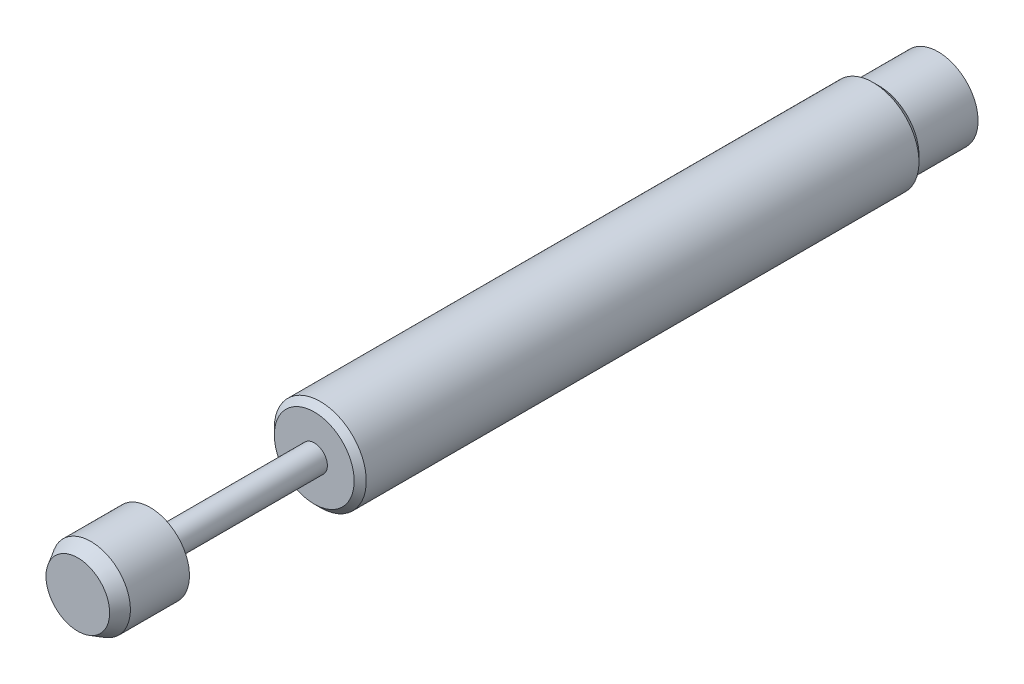
ISO-10303-21;
HEADER;
FILE_DESCRIPTION(('STEP AP214'),'2;1');
FILE_NAME('part.step','',(''),(''),'','','');
FILE_SCHEMA(('AUTOMOTIVE_DESIGN { 1 0 10303 214 1 1 1 1 }'));
ENDSEC;
DATA;
#1=APPLICATION_CONTEXT('core data for automotive mechanical design processes');
#2=APPLICATION_PROTOCOL_DEFINITION('international standard','automotive_design',2000,#1);
#3=PRODUCT_CONTEXT('',#1,'mechanical');
#4=PRODUCT('Part','Part','',(#3));
#5=PRODUCT_RELATED_PRODUCT_CATEGORY('part','',(#4));
#6=PRODUCT_DEFINITION_FORMATION('','',#4);
#7=PRODUCT_DEFINITION_CONTEXT('part definition',#1,'design');
#8=PRODUCT_DEFINITION('design','',#6,#7);
#9=PRODUCT_DEFINITION_SHAPE('','',#8);
#10=(LENGTH_UNIT() NAMED_UNIT(*) SI_UNIT(.MILLI.,.METRE.));
#11=(NAMED_UNIT(*) PLANE_ANGLE_UNIT() SI_UNIT($,.RADIAN.));
#12=(NAMED_UNIT(*) SI_UNIT($,.STERADIAN.) SOLID_ANGLE_UNIT());
#13=UNCERTAINTY_MEASURE_WITH_UNIT(LENGTH_MEASURE(1.E-05),#10,'distance_accuracy_value','');
#14=(GEOMETRIC_REPRESENTATION_CONTEXT(3) GLOBAL_UNCERTAINTY_ASSIGNED_CONTEXT((#13)) GLOBAL_UNIT_ASSIGNED_CONTEXT((#10,
#11,#12)) REPRESENTATION_CONTEXT('',''));
#15=CARTESIAN_POINT('',(0.,0.,0.));
#16=DIRECTION('',(0.,0.,1.));
#17=DIRECTION('',(1.,0.,0.));
#18=AXIS2_PLACEMENT_3D('',#15,#16,#17);
#19=CARTESIAN_POINT('',(0.,0.,36.));
#20=DIRECTION('',(0.,0.,-1.));
#21=DIRECTION('',(-1.,0.,0.));
#22=AXIS2_PLACEMENT_3D('',#19,#20,#21);
#23=PLANE('',#22);
#24=CARTESIAN_POINT('',(0.,0.,36.));
#25=DIRECTION('',(0.,0.,-1.));
#26=DIRECTION('',(-1.,0.,0.));
#27=AXIS2_PLACEMENT_3D('',#24,#25,#26);
#28=CIRCLE('',#27,4.8452994616207);
#29=CARTESIAN_POINT('',(-4.8452994616207,0.,36.));
#30=VERTEX_POINT('',#29);
#31=EDGE_CURVE('E50',#30,#30,#28,.T.);
#32=ORIENTED_EDGE('',*,*,#31,.F.);
#33=EDGE_LOOP('',(#32));
#34=FACE_BOUND('',#33,.T.);
#35=ADVANCED_FACE('F15',(#34),#23,.F.);
#36=CARTESIAN_POINT('',(0.,0.,36.));
#37=DIRECTION('',(0.,0.,-1.));
#38=DIRECTION('',(-1.,0.,0.));
#39=AXIS2_PLACEMENT_3D('',#36,#37,#38);
#40=CONICAL_SURFACE('',#39,4.8452994616207,0.523598775598316);
#41=CARTESIAN_POINT('',(0.,0.,34.));
#42=DIRECTION('',(0.,0.,-1.));
#43=DIRECTION('',(-1.,0.,0.));
#44=AXIS2_PLACEMENT_3D('',#41,#42,#43);
#45=CIRCLE('',#44,6.);
#46=CARTESIAN_POINT('',(-6.,0.,34.));
#47=VERTEX_POINT('',#46);
#48=EDGE_CURVE('E47',#47,#47,#45,.T.);
#49=ORIENTED_EDGE('',*,*,#48,.F.);
#50=EDGE_LOOP('',(#49));
#51=FACE_BOUND('',#50,.T.);
#52=ORIENTED_EDGE('',*,*,#31,.T.);
#53=EDGE_LOOP('',(#52));
#54=FACE_BOUND('',#53,.T.);
#55=ADVANCED_FACE('F54',(#51,#54),#40,.T.);
#56=CARTESIAN_POINT('',(0.,0.,-500.));
#57=DIRECTION('',(0.,0.,-1.));
#58=DIRECTION('',(-1.,0.,0.));
#59=AXIS2_PLACEMENT_3D('',#56,#57,#58);
#60=CYLINDRICAL_SURFACE('',#59,6.);
#61=CARTESIAN_POINT('',(0.,0.,25.));
#62=DIRECTION('',(0.,0.,-1.));
#63=DIRECTION('',(-1.,0.,0.));
#64=AXIS2_PLACEMENT_3D('',#61,#62,#63);
#65=CIRCLE('',#64,6.);
#66=CARTESIAN_POINT('',(-6.,0.,25.));
#67=VERTEX_POINT('',#66);
#68=EDGE_CURVE('E44',#67,#67,#65,.T.);
#69=ORIENTED_EDGE('',*,*,#68,.F.);
#70=EDGE_LOOP('',(#69));
#71=FACE_BOUND('',#70,.T.);
#72=ORIENTED_EDGE('',*,*,#48,.T.);
#73=EDGE_LOOP('',(#72));
#74=FACE_BOUND('',#73,.T.);
#75=ADVANCED_FACE('F62',(#71,#74),#60,.T.);
#76=CARTESIAN_POINT('',(0.,6.,25.));
#77=DIRECTION('',(0.,0.,1.));
#78=DIRECTION('',(1.,0.,0.));
#79=AXIS2_PLACEMENT_3D('',#76,#77,#78);
#80=PLANE('',#79);
#81=CARTESIAN_POINT('',(0.,0.,25.));
#82=DIRECTION('',(0.,0.,-1.));
#83=DIRECTION('',(-1.,0.,0.));
#84=AXIS2_PLACEMENT_3D('',#81,#82,#83);
#85=CIRCLE('',#84,2.);
#86=CARTESIAN_POINT('',(-2.,0.,25.));
#87=VERTEX_POINT('',#86);
#88=EDGE_CURVE('E41',#87,#87,#85,.T.);
#89=ORIENTED_EDGE('',*,*,#88,.F.);
#90=EDGE_LOOP('',(#89));
#91=FACE_BOUND('',#90,.T.);
#92=ORIENTED_EDGE('',*,*,#68,.T.);
#93=EDGE_LOOP('',(#92));
#94=FACE_BOUND('',#93,.T.);
#95=ADVANCED_FACE('F68',(#91,#94),#80,.F.);
#96=CARTESIAN_POINT('',(0.,0.,-500.));
#97=DIRECTION('',(0.,0.,-1.));
#98=DIRECTION('',(-1.,0.,0.));
#99=AXIS2_PLACEMENT_3D('',#96,#97,#98);
#100=CYLINDRICAL_SURFACE('',#99,2.);
#101=CARTESIAN_POINT('',(0.,0.,0.));
#102=DIRECTION('',(0.,0.,-1.));
#103=DIRECTION('',(-1.,0.,0.));
#104=AXIS2_PLACEMENT_3D('',#101,#102,#103);
#105=CIRCLE('',#104,2.);
#106=CARTESIAN_POINT('',(-2.,0.,0.));
#107=VERTEX_POINT('',#106);
#108=EDGE_CURVE('E38',#107,#107,#105,.T.);
#109=ORIENTED_EDGE('',*,*,#108,.F.);
#110=EDGE_LOOP('',(#109));
#111=FACE_BOUND('',#110,.T.);
#112=ORIENTED_EDGE('',*,*,#88,.T.);
#113=EDGE_LOOP('',(#112));
#114=FACE_BOUND('',#113,.T.);
#115=ADVANCED_FACE('F72',(#111,#114),#100,.T.);
#116=CARTESIAN_POINT('',(0.,2.,0.));
#117=DIRECTION('',(0.,0.,-1.));
#118=DIRECTION('',(-1.,0.,0.));
#119=AXIS2_PLACEMENT_3D('',#116,#117,#118);
#120=PLANE('',#119);
#121=CARTESIAN_POINT('',(0.,0.,0.));
#122=DIRECTION('',(0.,0.,-1.));
#123=DIRECTION('',(-1.,0.,0.));
#124=AXIS2_PLACEMENT_3D('',#121,#122,#123);
#125=CIRCLE('',#124,6.08);
#126=CARTESIAN_POINT('',(-6.08,0.,0.));
#127=VERTEX_POINT('',#126);
#128=EDGE_CURVE('E35',#127,#127,#125,.T.);
#129=ORIENTED_EDGE('',*,*,#128,.F.);
#130=EDGE_LOOP('',(#129));
#131=FACE_BOUND('',#130,.T.);
#132=ORIENTED_EDGE('',*,*,#108,.T.);
#133=EDGE_LOOP('',(#132));
#134=FACE_BOUND('',#133,.T.);
#135=ADVANCED_FACE('F76',(#131,#134),#120,.F.);
#136=CARTESIAN_POINT('',(0.,0.,0.));
#137=DIRECTION('',(0.,0.,-1.));
#138=DIRECTION('',(-1.,0.,0.));
#139=AXIS2_PLACEMENT_3D('',#136,#137,#138);
#140=CONICAL_SURFACE('',#139,6.08,0.78539816339746);
#141=CARTESIAN_POINT('',(0.,0.,-0.919999999999959));
#142=DIRECTION('',(0.,0.,-1.));
#143=DIRECTION('',(-1.,0.,0.));
#144=AXIS2_PLACEMENT_3D('',#141,#142,#143);
#145=CIRCLE('',#144,7.);
#146=CARTESIAN_POINT('',(-7.,0.,-0.919999999999959));
#147=VERTEX_POINT('',#146);
#148=EDGE_CURVE('E30',#147,#147,#145,.T.);
#149=ORIENTED_EDGE('',*,*,#148,.F.);
#150=EDGE_LOOP('',(#149));
#151=FACE_BOUND('',#150,.T.);
#152=ORIENTED_EDGE('',*,*,#128,.T.);
#153=EDGE_LOOP('',(#152));
#154=FACE_BOUND('',#153,.T.);
#155=ADVANCED_FACE('F80',(#151,#154),#140,.T.);
#156=CARTESIAN_POINT('',(0.,0.,-500.));
#157=DIRECTION('',(0.,0.,-1.));
#158=DIRECTION('',(-1.,0.,0.));
#159=AXIS2_PLACEMENT_3D('',#156,#157,#158);
#160=CYLINDRICAL_SURFACE('',#159,7.);
#161=CARTESIAN_POINT('',(0.,0.,-85.08));
#162=DIRECTION('',(0.,0.,-1.));
#163=DIRECTION('',(-1.,0.,0.));
#164=AXIS2_PLACEMENT_3D('',#161,#162,#163);
#165=CIRCLE('',#164,7.);
#166=CARTESIAN_POINT('',(-7.,0.,-85.08));
#167=VERTEX_POINT('',#166);
#168=EDGE_CURVE('E26',#167,#167,#165,.T.);
#169=ORIENTED_EDGE('',*,*,#168,.F.);
#170=EDGE_LOOP('',(#169));
#171=FACE_BOUND('',#170,.T.);
#172=ORIENTED_EDGE('',*,*,#148,.T.);
#173=EDGE_LOOP('',(#172));
#174=FACE_BOUND('',#173,.T.);
#175=ADVANCED_FACE('F84',(#171,#174),#160,.T.);
#176=CARTESIAN_POINT('',(0.,0.,-85.08));
#177=DIRECTION('',(0.,0.,1.));
#178=DIRECTION('',(1.,0.,0.));
#179=AXIS2_PLACEMENT_3D('',#176,#177,#178);
#180=CONICAL_SURFACE('',#179,7.,0.785398163397431);
#181=CARTESIAN_POINT('',(0.,0.,-86.));
#182=DIRECTION('',(0.,0.,-1.));
#183=DIRECTION('',(-1.,0.,0.));
#184=AXIS2_PLACEMENT_3D('',#181,#182,#183);
#185=CIRCLE('',#184,6.08);
#186=CARTESIAN_POINT('',(-6.08,0.,-86.));
#187=VERTEX_POINT('',#186);
#188=EDGE_CURVE('E22',#187,#187,#185,.T.);
#189=ORIENTED_EDGE('',*,*,#188,.F.);
#190=EDGE_LOOP('',(#189));
#191=FACE_BOUND('',#190,.T.);
#192=ORIENTED_EDGE('',*,*,#168,.T.);
#193=EDGE_LOOP('',(#192));
#194=FACE_BOUND('',#193,.T.);
#195=ADVANCED_FACE('F88',(#191,#194),#180,.T.);
#196=CARTESIAN_POINT('',(0.,0.,-500.));
#197=DIRECTION('',(0.,0.,-1.));
#198=DIRECTION('',(-1.,0.,0.));
#199=AXIS2_PLACEMENT_3D('',#196,#197,#198);
#200=CYLINDRICAL_SURFACE('',#199,6.08);
#201=CARTESIAN_POINT('',(0.,0.,-95.));
#202=DIRECTION('',(0.,0.,-1.));
#203=DIRECTION('',(-1.,0.,0.));
#204=AXIS2_PLACEMENT_3D('',#201,#202,#203);
#205=CIRCLE('',#204,6.08);
#206=CARTESIAN_POINT('',(-6.08,0.,-95.));
#207=VERTEX_POINT('',#206);
#208=EDGE_CURVE('E10',#207,#207,#205,.T.);
#209=ORIENTED_EDGE('',*,*,#208,.F.);
#210=EDGE_LOOP('',(#209));
#211=FACE_BOUND('',#210,.T.);
#212=ORIENTED_EDGE('',*,*,#188,.T.);
#213=EDGE_LOOP('',(#212));
#214=FACE_BOUND('',#213,.T.);
#215=ADVANCED_FACE('F91',(#211,#214),#200,.T.);
#216=CARTESIAN_POINT('',(0.,6.08,-95.));
#217=DIRECTION('',(0.,0.,1.));
#218=DIRECTION('',(1.,0.,0.));
#219=AXIS2_PLACEMENT_3D('',#216,#217,#218);
#220=PLANE('',#219);
#221=ORIENTED_EDGE('',*,*,#208,.T.);
#222=EDGE_LOOP('',(#221));
#223=FACE_BOUND('',#222,.T.);
#224=ADVANCED_FACE('F17',(#223),#220,.F.);
#225=CLOSED_SHELL('',(#35,#55,#75,#95,#115,#135,#155,#175,#195,#215,#224));
#226=MANIFOLD_SOLID_BREP('B1',#225);
#227=ADVANCED_BREP_SHAPE_REPRESENTATION('',(#18,#226),#14);
#228=SHAPE_DEFINITION_REPRESENTATION(#9,#227);
ENDSEC;
END-ISO-10303-21;
